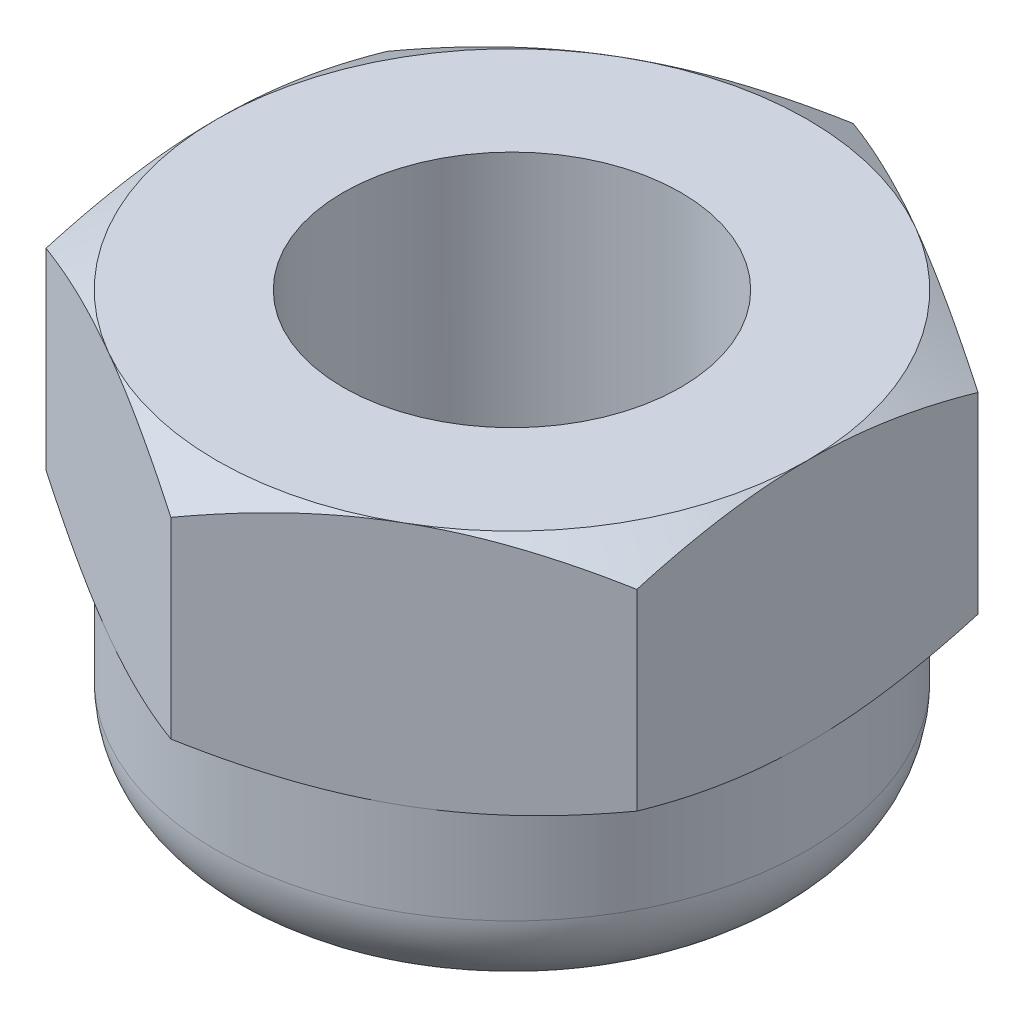
ISO-10303-21;
HEADER;
FILE_DESCRIPTION(('STEP AP214'),'2;1');
FILE_NAME('part.step','',(''),(''),'','','');
FILE_SCHEMA(('AUTOMOTIVE_DESIGN { 1 0 10303 214 1 1 1 1 }'));
ENDSEC;
DATA;
#1=APPLICATION_CONTEXT('core data for automotive mechanical design processes');
#2=APPLICATION_PROTOCOL_DEFINITION('international standard','automotive_design',2000,#1);
#3=PRODUCT_CONTEXT('',#1,'mechanical');
#4=PRODUCT('Part','Part','',(#3));
#5=PRODUCT_RELATED_PRODUCT_CATEGORY('part','',(#4));
#6=PRODUCT_DEFINITION_FORMATION('','',#4);
#7=PRODUCT_DEFINITION_CONTEXT('part definition',#1,'design');
#8=PRODUCT_DEFINITION('design','',#6,#7);
#9=PRODUCT_DEFINITION_SHAPE('','',#8);
#10=(LENGTH_UNIT() NAMED_UNIT(*) SI_UNIT(.MILLI.,.METRE.));
#11=(NAMED_UNIT(*) PLANE_ANGLE_UNIT() SI_UNIT($,.RADIAN.));
#12=(NAMED_UNIT(*) SI_UNIT($,.STERADIAN.) SOLID_ANGLE_UNIT());
#13=UNCERTAINTY_MEASURE_WITH_UNIT(LENGTH_MEASURE(1.E-05),#10,'distance_accuracy_value','');
#14=(GEOMETRIC_REPRESENTATION_CONTEXT(3) GLOBAL_UNCERTAINTY_ASSIGNED_CONTEXT((#13)) GLOBAL_UNIT_ASSIGNED_CONTEXT((#10,
#11,#12)) REPRESENTATION_CONTEXT('',''));
#15=CARTESIAN_POINT('',(0.,0.,0.));
#16=DIRECTION('',(0.,0.,1.));
#17=DIRECTION('',(1.,0.,0.));
#18=AXIS2_PLACEMENT_3D('',#15,#16,#17);
#19=CARTESIAN_POINT('',(3.5,2.9,2.02072594216369));
#20=DIRECTION('',(-1.,0.,0.));
#21=DIRECTION('',(0.,0.,1.));
#22=AXIS2_PLACEMENT_3D('',#19,#20,#21);
#23=PLANE('',#22);
#24=CARTESIAN_POINT('',(3.5,1.75221798405278,-5.51863367248825));
#25=CARTESIAN_POINT('',(3.5,1.67732442804157,-5.36498509851175));
#26=CARTESIAN_POINT('',(3.5,1.6031231891369,-5.21099341584793));
#27=CARTESIAN_POINT('',(3.5,1.45649296997795,-4.90214171197753));
#28=CARTESIAN_POINT('',(3.5,1.3840642522182,-4.74728156628347));
#29=CARTESIAN_POINT('',(3.5,1.24102143969356,-4.43575550019317));
#30=CARTESIAN_POINT('',(3.5,1.17041861680827,-4.27908438687699));
#31=CARTESIAN_POINT('',(3.5,1.03198343362489,-3.96452743537923));
#32=CARTESIAN_POINT('',(3.5,0.964150948265603,-3.80664165241465));
#33=CARTESIAN_POINT('',(3.5,0.829718098878579,-3.48396366444411));
#34=CARTESIAN_POINT('',(3.5,0.763239814940772,-3.31912032960149));
#35=CARTESIAN_POINT('',(3.5,0.635098415601103,-2.98753880843402));
#36=CARTESIAN_POINT('',(3.5,0.573435827779177,-2.82080041678345));
#37=CARTESIAN_POINT('',(3.5,0.456478517309419,-2.48544744392412));
#38=CARTESIAN_POINT('',(3.5,0.40117164651928,-2.31683714099685));
#39=CARTESIAN_POINT('',(3.5,0.298640302302864,-1.97719921369625));
#40=CARTESIAN_POINT('',(3.5,0.251413376907704,-1.80617233978074));
#41=CARTESIAN_POINT('',(3.5,0.167505297643178,-1.46257631451902));
#42=CARTESIAN_POINT('',(3.5,0.130763467984196,-1.29002225161434));
#43=CARTESIAN_POINT('',(3.5,0.0698337298556786,-0.942675952516883));
#44=CARTESIAN_POINT('',(3.5,0.0456444908928947,-0.767883955543815));
#45=CARTESIAN_POINT('',(3.5,0.0120616276352312,-0.419253617479358));
#46=CARTESIAN_POINT('',(3.5,0.0024708291488457,-0.245434751388826));
#47=CARTESIAN_POINT('',(3.5,-0.00162718328259984,0.102398182663509));
#48=CARTESIAN_POINT('',(3.5,0.00386568220883732,0.276412251648501));
#49=CARTESIAN_POINT('',(3.5,0.0254017587907872,0.569211961742458));
#50=CARTESIAN_POINT('',(3.5,0.0376207959948863,0.688298160754819));
#51=CARTESIAN_POINT('',(3.5,0.0684099076642928,0.925652102121974));
#52=CARTESIAN_POINT('',(3.5,0.0869807716158405,1.04391974087045));
#53=CARTESIAN_POINT('',(3.5,0.151250626382069,1.39730799314287));
#54=CARTESIAN_POINT('',(3.5,0.205496869475397,1.63089439911262));
#55=CARTESIAN_POINT('',(3.5,0.30023946922369,1.98029185795325));
#56=CARTESIAN_POINT('',(3.5,0.334507928406217,2.09789544468369));
#57=CARTESIAN_POINT('',(3.5,0.406774363526277,2.33196218309537));
#58=CARTESIAN_POINT('',(3.5,0.444772366161091,2.44842532660637));
#59=CARTESIAN_POINT('',(3.5,0.523874133729436,2.68024482179015));
#60=CARTESIAN_POINT('',(3.5,0.564977002789837,2.79560148198123));
#61=CARTESIAN_POINT('',(3.5,0.649788075888322,3.02534777801573));
#62=CARTESIAN_POINT('',(3.5,0.693496236198847,3.13973743005278));
#63=CARTESIAN_POINT('',(3.5,0.806380461684521,3.42691114161474));
#64=CARTESIAN_POINT('',(3.5,0.876982640338044,3.59913384480237));
#65=CARTESIAN_POINT('',(3.5,1.02204710120962,3.9419513449622));
#66=CARTESIAN_POINT('',(3.5,1.09650971093041,4.1125460023594));
#67=CARTESIAN_POINT('',(3.5,1.24845478974022,4.45243751951838));
#68=CARTESIAN_POINT('',(3.5,1.32593808601369,4.6217340083846));
#69=CARTESIAN_POINT('',(3.5,1.48327345238332,4.95922460715622));
#70=CARTESIAN_POINT('',(3.5,1.56312558567321,5.12741868750614));
#71=CARTESIAN_POINT('',(3.5,1.80570351704901,5.63109508774223));
#72=CARTESIAN_POINT('',(3.5,1.97124553878938,5.96521974920382));
#73=CARTESIAN_POINT('',(3.5,2.30721210046437,6.63091789328421));
#74=CARTESIAN_POINT('',(3.5,2.47763583410027,6.96249178586031));
#75=CARTESIAN_POINT('',(3.5,2.80566196800848,7.59268121527547));
#76=CARTESIAN_POINT('',(3.5,2.96295809914389,7.89145646849738));
#77=CARTESIAN_POINT('',(3.5,3.27962393001051,8.48792265891552));
#78=CARTESIAN_POINT('',(3.5,3.43899372934341,8.78561354314216));
#79=CARTESIAN_POINT('',(3.5,3.75881188742457,9.37926265804874));
#80=CARTESIAN_POINT('',(3.5,3.91925557679138,9.67522340748776));
#81=CARTESIAN_POINT('',(3.5,4.24135194779674,10.2664606109715));
#82=CARTESIAN_POINT('',(3.5,4.40300454687335,10.5617371099748));
#83=CARTESIAN_POINT('',(3.5,4.56510217991107,10.8567672978899));
#84=B_SPLINE_CURVE_WITH_KNOTS('',3,(#24,#25,#26,#27,#28,#29,#30,#31,#32,#33,#34,#35,#36,#37,#38,
#39,#40,#41,#42,#43,#44,#45,#46,#47,#48,#49,#50,#51,#52,#53,#54,#55,#56,#57,#58,#59,#60,#61,#62,
#63,#64,#65,#66,#67,#68,#69,#70,#71,#72,#73,#74,#75,#76,#77,#78,#79,#80,#81,#82,#83),
.UNSPECIFIED.,.F.,.F.,(4,2,2,2,2,2,2,2,2,2,2,2,2,2,2,2,2,2,2,2,2,2,2,2,2,2,2,2,2,4),(0.,
0.51279464820139,1.02566478271509,1.54117731607442,2.05666655189903,2.58983830237006,
3.12306838236736,3.65526168525764,4.18729319931276,4.7161804163529,5.24501156332019,
5.76663460089152,6.28826038553984,6.64722220323954,7.00622865352666,7.72459979118937,
8.09205003333389,8.45950290599815,8.82685015643985,9.19419124301126,9.75252231684298,
10.3109008348907,10.8694333483491,11.4279807752647,12.5465640652309,13.6649636552851,
14.6779080328988,15.6909012448293,16.7008557882807,17.7107419760252),.UNSPECIFIED.);
#85=CARTESIAN_POINT('',(3.5,0.312607391169548,-2.02072594216384));
#86=VERTEX_POINT('',#85);
#87=CARTESIAN_POINT('',(3.5,0.,0.));
#88=VERTEX_POINT('',#87);
#89=EDGE_CURVE('E152',#86,#88,#84,.T.);
#90=ORIENTED_EDGE('',*,*,#89,.F.);
#91=DIRECTION('',(0.,-1.,0.));
#92=VECTOR('',#91,1.);
#93=CARTESIAN_POINT('',(3.5,2.9,-2.02072594216369));
#94=LINE('',#93,#92);
#95=CARTESIAN_POINT('',(3.5,2.58739260883036,-2.02072594216369));
#96=VERTEX_POINT('',#95);
#97=EDGE_CURVE('E161',#96,#86,#94,.T.);
#98=ORIENTED_EDGE('',*,*,#97,.F.);
#99=CARTESIAN_POINT('',(3.5,1.14778201594725,-5.51863367248824));
#100=CARTESIAN_POINT('',(3.5,1.22267557195846,-5.36498509851174));
#101=CARTESIAN_POINT('',(3.5,1.29687681086313,-5.21099341584793));
#102=CARTESIAN_POINT('',(3.5,1.44350703002208,-4.90214171197753));
#103=CARTESIAN_POINT('',(3.5,1.51593574778183,-4.74728156628346));
#104=CARTESIAN_POINT('',(3.5,1.65897856030646,-4.43575550019317));
#105=CARTESIAN_POINT('',(3.5,1.72958138319175,-4.27908438687698));
#106=CARTESIAN_POINT('',(3.5,1.86801656637513,-3.96452743537922));
#107=CARTESIAN_POINT('',(3.5,1.93584905173442,-3.80664165241464));
#108=CARTESIAN_POINT('',(3.5,2.07028190112144,-3.4839636644441));
#109=CARTESIAN_POINT('',(3.5,2.13676018505924,-3.31912032960149));
#110=CARTESIAN_POINT('',(3.5,2.26490158439891,-2.98753880843402));
#111=CARTESIAN_POINT('',(3.5,2.32656417222084,-2.82080041678344));
#112=CARTESIAN_POINT('',(3.5,2.44352148269059,-2.48544744392411));
#113=CARTESIAN_POINT('',(3.5,2.49882835348073,-2.31683714099684));
#114=CARTESIAN_POINT('',(3.5,2.60135969769714,-1.97719921369624));
#115=CARTESIAN_POINT('',(3.5,2.6485866230923,-1.80617233978073));
#116=CARTESIAN_POINT('',(3.5,2.73249470235683,-1.46257631451902));
#117=CARTESIAN_POINT('',(3.5,2.76923653201581,-1.29002225161434));
#118=CARTESIAN_POINT('',(3.5,2.83016627014432,-0.942675952516881));
#119=CARTESIAN_POINT('',(3.5,2.85435550910711,-0.767883955543813));
#120=CARTESIAN_POINT('',(3.5,2.88793837236477,-0.419253617479357));
#121=CARTESIAN_POINT('',(3.5,2.89752917085115,-0.245434751388826));
#122=CARTESIAN_POINT('',(3.5,2.9016271832826,0.102398182663508));
#123=CARTESIAN_POINT('',(3.5,2.89613431779116,0.2764122516485));
#124=CARTESIAN_POINT('',(3.5,2.87459824120921,0.569211961742459));
#125=CARTESIAN_POINT('',(3.5,2.86237920400511,0.688298160754822));
#126=CARTESIAN_POINT('',(3.5,2.83159009233571,0.925652102121981));
#127=CARTESIAN_POINT('',(3.5,2.81301922838416,1.04391974087046));
#128=CARTESIAN_POINT('',(3.5,2.74874937361793,1.39730799314289));
#129=CARTESIAN_POINT('',(3.5,2.6945031305246,1.63089439911264));
#130=CARTESIAN_POINT('',(3.5,2.59976053077631,1.98029185795328));
#131=CARTESIAN_POINT('',(3.5,2.56549207159378,2.09789544468372));
#132=CARTESIAN_POINT('',(3.5,2.49322563647372,2.3319621830954));
#133=CARTESIAN_POINT('',(3.5,2.4552276338389,2.44842532660641));
#134=CARTESIAN_POINT('',(3.5,2.37612586627056,2.6802448217902));
#135=CARTESIAN_POINT('',(3.5,2.33502299721016,2.79560148198128));
#136=CARTESIAN_POINT('',(3.5,2.25021192411167,3.02534777801579));
#137=CARTESIAN_POINT('',(3.5,2.20650376380114,3.13973743005284));
#138=CARTESIAN_POINT('',(3.5,2.09361953831547,3.42691114161479));
#139=CARTESIAN_POINT('',(3.5,2.02301735966195,3.59913384480242));
#140=CARTESIAN_POINT('',(3.5,1.87795289879037,3.94195134496225));
#141=CARTESIAN_POINT('',(3.5,1.80349028906959,4.11254600235945));
#142=CARTESIAN_POINT('',(3.5,1.65154521025978,4.45243751951843));
#143=CARTESIAN_POINT('',(3.5,1.57406191398631,4.62173400838465));
#144=CARTESIAN_POINT('',(3.5,1.41672654761668,4.95922460715627));
#145=CARTESIAN_POINT('',(3.5,1.33687441432679,5.12741868750619));
#146=CARTESIAN_POINT('',(3.5,1.09429648295099,5.63109508774227));
#147=CARTESIAN_POINT('',(3.5,0.928754461210627,5.96521974920386));
#148=CARTESIAN_POINT('',(3.5,0.592787899535648,6.63091789328426));
#149=CARTESIAN_POINT('',(3.5,0.422364165899751,6.96249178586035));
#150=CARTESIAN_POINT('',(3.5,0.0943380319915446,7.59268121527551));
#151=CARTESIAN_POINT('',(3.5,-0.0629580991438635,7.89145646849742));
#152=CARTESIAN_POINT('',(3.5,-0.379623930010473,8.48792265891556));
#153=CARTESIAN_POINT('',(3.5,-0.538993729343374,8.7856135431422));
#154=CARTESIAN_POINT('',(3.5,-0.858811887424525,9.37926265804877));
#155=CARTESIAN_POINT('',(3.5,-1.01925557679133,9.67522340748779));
#156=CARTESIAN_POINT('',(3.5,-1.34135194779669,10.2664606109715));
#157=CARTESIAN_POINT('',(3.5,-1.50300454687329,10.5617371099749));
#158=CARTESIAN_POINT('',(3.5,-1.66510217991102,10.85676729789));
#159=B_SPLINE_CURVE_WITH_KNOTS('',3,(#99,#100,#101,#102,#103,#104,#105,#106,#107,#108,#109,#110,
#111,#112,#113,#114,#115,#116,#117,#118,#119,#120,#121,#122,#123,#124,#125,#126,#127,#128,#129,
#130,#131,#132,#133,#134,#135,#136,#137,#138,#139,#140,#141,#142,#143,#144,#145,#146,#147,#148,
#149,#150,#151,#152,#153,#154,#155,#156,#157,#158),.UNSPECIFIED.,.F.,.F.,(4,2,2,2,2,2,2,2,2,2,2,
2,2,2,2,2,2,2,2,2,2,2,2,2,2,2,2,2,2,4),(0.,0.51279464820139,1.02566478271509,1.54117731607441,
2.05666655189902,2.58983830237005,3.12306838236735,3.65526168525763,4.18729319931275,
4.71618041635289,5.24501156332018,5.7666346008915,6.28826038553982,6.64722220323953,
7.00622865352666,7.72459979118938,8.09205003333391,8.45950290599817,8.82685015643989,
9.19419124301131,9.75252231684302,10.3109008348907,10.8694333483491,11.4279807752647,
12.5465640652309,13.6649636552851,14.6779080328988,15.6909012448293,16.7008557882807,
17.7107419760252),.UNSPECIFIED.);
#160=CARTESIAN_POINT('',(3.5,2.9,0.));
#161=VERTEX_POINT('',#160);
#162=EDGE_CURVE('E226',#161,#96,#159,.F.);
#163=ORIENTED_EDGE('',*,*,#162,.F.);
#164=CARTESIAN_POINT('',(3.5,2.58739260883036,2.02072594216369));
#165=VERTEX_POINT('',#164);
#166=EDGE_CURVE('E233',#165,#161,#159,.F.);
#167=ORIENTED_EDGE('',*,*,#166,.F.);
#168=DIRECTION('',(0.,-1.,0.));
#169=VECTOR('',#168,1.);
#170=CARTESIAN_POINT('',(3.5,2.9,2.02072594216369));
#171=LINE('',#170,#169);
#172=CARTESIAN_POINT('',(3.5,0.312607391169645,2.02072594216369));
#173=VERTEX_POINT('',#172);
#174=EDGE_CURVE('E244',#165,#173,#171,.T.);
#175=ORIENTED_EDGE('',*,*,#174,.T.);
#176=EDGE_CURVE('E216',#88,#173,#84,.T.);
#177=ORIENTED_EDGE('',*,*,#176,.F.);
#178=EDGE_LOOP('',(#90,#98,#163,#167,#175,#177));
#179=FACE_BOUND('',#178,.T.);
#180=ADVANCED_FACE('F40',(#179),#23,.F.);
#181=CARTESIAN_POINT('',(3.5,2.9,-2.02072594216369));
#182=DIRECTION('',(-0.5,0.,0.866025403784439));
#183=DIRECTION('',(0.866025403784439,0.,0.5));
#184=AXIS2_PLACEMENT_3D('',#181,#182,#183);
#185=PLANE('',#184);
#186=CARTESIAN_POINT('',(-0.000199999999999978,0.312674060693372,-4.04156735438122));
#187=CARTESIAN_POINT('',(0.153607178452449,0.261385788989984,-3.9527667384984));
#188=CARTESIAN_POINT('',(0.308742010834424,0.214740953816197,-3.86319960126198));
#189=CARTESIAN_POINT('',(0.621698006576782,0.133321875533349,-3.68251437287562));
#190=CARTESIAN_POINT('',(0.779524730787496,0.0985764355845613,-3.59139307116725));
#191=CARTESIAN_POINT('',(1.09322221038013,0.0444900271828356,-3.41027974688034));
#192=CARTESIAN_POINT('',(1.24904469916069,0.0247890862603808,-3.32031559103708));
#193=CARTESIAN_POINT('',(1.56142288720538,0.00127013273725356,-3.13996396008051));
#194=CARTESIAN_POINT('',(1.71797745103423,-0.00256735545443535,-3.04957714051106));
#195=CARTESIAN_POINT('',(2.01050921992099,0.00541530187697738,-2.88068384499777));
#196=CARTESIAN_POINT('',(2.14653021245791,0.0152754340696069,-2.80215208834114));
#197=CARTESIAN_POINT('',(2.417686020289,0.0465264668994034,-2.64560020969753));
#198=CARTESIAN_POINT('',(2.55281989768468,0.0679280432857981,-2.5675806292065));
#199=CARTESIAN_POINT('',(2.82453479240518,0.121430407880577,-2.41070596159678));
#200=CARTESIAN_POINT('',(2.96108141927834,0.153757994445087,-2.33187072981463));
#201=CARTESIAN_POINT('',(3.2321380929445,0.227128933807995,-2.17537608630783));
#202=CARTESIAN_POINT('',(3.36665161246854,0.268155046569867,-2.09771466960098));
#203=CARTESIAN_POINT('',(3.5002,0.312674060693372,-2.02061047210985));
#204=B_SPLINE_CURVE_WITH_KNOTS('',3,(#186,#187,#188,#189,#190,#191,#192,#193,#194,#195,#196,
#197,#198,#199,#200,#201,#202,#203),.UNSPECIFIED.,.F.,.F.,(4,2,2,2,2,2,2,2,4),(0.,
0.554793832886254,1.11092123814984,1.65328467083219,2.19498204478403,2.6666513085086,
3.13875761298267,3.6213361260051,4.10296698719187),.UNSPECIFIED.);
#205=CARTESIAN_POINT('',(0.,0.312607391169644,-4.04145188432738));
#206=VERTEX_POINT('',#205);
#207=CARTESIAN_POINT('',(1.75,0.,-3.03108891324554));
#208=VERTEX_POINT('',#207);
#209=EDGE_CURVE('E139',#206,#208,#204,.T.);
#210=ORIENTED_EDGE('',*,*,#209,.F.);
#211=DIRECTION('',(0.,-1.,0.));
#212=VECTOR('',#211,1.);
#213=CARTESIAN_POINT('',(0.,2.9,-4.04145188432738));
#214=LINE('',#213,#212);
#215=CARTESIAN_POINT('',(0.,2.58739260883036,-4.04145188432738));
#216=VERTEX_POINT('',#215);
#217=EDGE_CURVE('E256',#216,#206,#214,.T.);
#218=ORIENTED_EDGE('',*,*,#217,.F.);
#219=CARTESIAN_POINT('',(3.5002,2.58732593930663,-2.02061047210985));
#220=CARTESIAN_POINT('',(3.34639282154755,2.63861421101002,-2.10941108799267));
#221=CARTESIAN_POINT('',(3.19125798916558,2.68525904618381,-2.19897822522909));
#222=CARTESIAN_POINT('',(2.87830199342322,2.76667812446665,-2.37966345361545));
#223=CARTESIAN_POINT('',(2.72047526921251,2.80142356441544,-2.47078475532382));
#224=CARTESIAN_POINT('',(2.40677778961987,2.85550997281717,-2.65189807961073));
#225=CARTESIAN_POINT('',(2.25095530083931,2.87521091373962,-2.74186223545399));
#226=CARTESIAN_POINT('',(1.93857711279463,2.89872986726275,-2.92221386641055));
#227=CARTESIAN_POINT('',(1.78202254896577,2.90256735545444,-3.01260068598001));
#228=CARTESIAN_POINT('',(1.48949078007901,2.89458469812302,-3.1814939814933));
#229=CARTESIAN_POINT('',(1.3534697875421,2.88472456593039,-3.26002573814993));
#230=CARTESIAN_POINT('',(1.08231397971101,2.8534735331006,-3.41657761679354));
#231=CARTESIAN_POINT('',(0.947180102315318,2.8320719567142,-3.49459719728457));
#232=CARTESIAN_POINT('',(0.675465207594817,2.77856959211943,-3.65147186489429));
#233=CARTESIAN_POINT('',(0.538918580721665,2.74624200555492,-3.73030709667644));
#234=CARTESIAN_POINT('',(0.267861907055498,2.67287106619201,-3.88680174018324));
#235=CARTESIAN_POINT('',(0.133348387531463,2.63184495343014,-3.96446315689009));
#236=CARTESIAN_POINT('',(-0.000200000000000802,2.58732593930663,-4.04156735438122));
#237=B_SPLINE_CURVE_WITH_KNOTS('',3,(#219,#220,#221,#222,#223,#224,#225,#226,#227,#228,#229,
#230,#231,#232,#233,#234,#235,#236),.UNSPECIFIED.,.F.,.F.,(4,2,2,2,2,2,2,2,4),(0.,
0.554793832886253,1.11092123814983,1.65328467083218,2.19498204478403,2.6666513085086,
3.13875761298267,3.62133612600509,4.10296698719187),.UNSPECIFIED.);
#238=CARTESIAN_POINT('',(1.75,2.9,-3.03108891324554));
#239=VERTEX_POINT('',#238);
#240=EDGE_CURVE('E235',#239,#216,#237,.T.);
#241=ORIENTED_EDGE('',*,*,#240,.F.);
#242=EDGE_CURVE('E234',#96,#239,#237,.T.);
#243=ORIENTED_EDGE('',*,*,#242,.F.);
#244=ORIENTED_EDGE('',*,*,#97,.T.);
#245=EDGE_CURVE('E147',#208,#86,#204,.T.);
#246=ORIENTED_EDGE('',*,*,#245,.F.);
#247=EDGE_LOOP('',(#210,#218,#241,#243,#244,#246));
#248=FACE_BOUND('',#247,.T.);
#249=ADVANCED_FACE('F158',(#248),#185,.F.);
#250=CARTESIAN_POINT('',(0.,2.9,-4.04145188432738));
#251=DIRECTION('',(0.5,0.,0.866025403784439));
#252=DIRECTION('',(0.866025403784439,0.,-0.5));
#253=AXIS2_PLACEMENT_3D('',#250,#251,#252);
#254=PLANE('',#253);
#255=CARTESIAN_POINT('',(-3.5002,0.312674060693372,-2.02061047210985));
#256=CARTESIAN_POINT('',(-3.34639282154755,0.261385788989985,-2.10941108799267));
#257=CARTESIAN_POINT('',(-3.19125798916558,0.214740953816198,-2.19897822522909));
#258=CARTESIAN_POINT('',(-2.87830199342322,0.133321875533349,-2.37966345361545));
#259=CARTESIAN_POINT('',(-2.7204752692125,0.0985764355845615,-2.47078475532382));
#260=CARTESIAN_POINT('',(-2.40677778961987,0.0444900271828358,-2.65189807961074));
#261=CARTESIAN_POINT('',(-2.25095530083931,0.0247890862603812,-2.74186223545399));
#262=CARTESIAN_POINT('',(-1.93857711279463,0.00127013273725388,-2.92221386641056));
#263=CARTESIAN_POINT('',(-1.78202254896577,-0.00256735545443532,-3.01260068598001));
#264=CARTESIAN_POINT('',(-1.48949078007901,0.00541530187697735,-3.1814939814933));
#265=CARTESIAN_POINT('',(-1.35346978754209,0.015275434069607,-3.26002573814993));
#266=CARTESIAN_POINT('',(-1.082313979711,0.0465264668994036,-3.41657761679354));
#267=CARTESIAN_POINT('',(-0.947180102315317,0.0679280432857982,-3.49459719728458));
#268=CARTESIAN_POINT('',(-0.675465207594816,0.121430407880577,-3.65147186489429));
#269=CARTESIAN_POINT('',(-0.538918580721664,0.153757994445087,-3.73030709667644));
#270=CARTESIAN_POINT('',(-0.267861907055498,0.227128933807995,-3.88680174018324));
#271=CARTESIAN_POINT('',(-0.133348387531463,0.268155046569868,-3.96446315689009));
#272=CARTESIAN_POINT('',(0.00020000000000004,0.312674060693372,-4.04156735438122));
#273=B_SPLINE_CURVE_WITH_KNOTS('',3,(#255,#256,#257,#258,#259,#260,#261,#262,#263,#264,#265,
#266,#267,#268,#269,#270,#271,#272),.UNSPECIFIED.,.F.,.F.,(4,2,2,2,2,2,2,2,4),(0.,
0.554793832886254,1.11092123814984,1.65328467083219,2.19498204478403,2.6666513085086,
3.13875761298267,3.6213361260051,4.10296698719187),.UNSPECIFIED.);
#274=CARTESIAN_POINT('',(-3.5,0.312607391169548,-2.02072594216384));
#275=VERTEX_POINT('',#274);
#276=CARTESIAN_POINT('',(-1.75,0.,-3.03108891324554));
#277=VERTEX_POINT('',#276);
#278=EDGE_CURVE('E313',#275,#277,#273,.T.);
#279=ORIENTED_EDGE('',*,*,#278,.F.);
#280=DIRECTION('',(0.,-1.,0.));
#281=VECTOR('',#280,1.);
#282=CARTESIAN_POINT('',(-3.5,2.9,-2.02072594216369));
#283=LINE('',#282,#281);
#284=CARTESIAN_POINT('',(-3.5,2.58739260883046,-2.02072594216384));
#285=VERTEX_POINT('',#284);
#286=EDGE_CURVE('E253',#285,#275,#283,.T.);
#287=ORIENTED_EDGE('',*,*,#286,.F.);
#288=CARTESIAN_POINT('',(0.00020000000000009,2.58732593930663,-4.04156735438122));
#289=CARTESIAN_POINT('',(-0.15360717845245,2.63861421101002,-3.9527667384984));
#290=CARTESIAN_POINT('',(-0.308742010834424,2.68525904618381,-3.86319960126198));
#291=CARTESIAN_POINT('',(-0.621698006576781,2.76667812446665,-3.68251437287562));
#292=CARTESIAN_POINT('',(-0.779524730787495,2.80142356441544,-3.59139307116725));
#293=CARTESIAN_POINT('',(-1.09322221038013,2.85550997281717,-3.41027974688034));
#294=CARTESIAN_POINT('',(-1.24904469916069,2.87521091373962,-3.32031559103708));
#295=CARTESIAN_POINT('',(-1.56142288720537,2.89872986726275,-3.13996396008052));
#296=CARTESIAN_POINT('',(-1.71797745103423,2.90256735545444,-3.04957714051106));
#297=CARTESIAN_POINT('',(-2.01050921992099,2.89458469812302,-2.88068384499777));
#298=CARTESIAN_POINT('',(-2.1465302124579,2.88472456593039,-2.80215208834115));
#299=CARTESIAN_POINT('',(-2.41768602028899,2.8534735331006,-2.64560020969754));
#300=CARTESIAN_POINT('',(-2.55281989768468,2.8320719567142,-2.5675806292065));
#301=CARTESIAN_POINT('',(-2.82453479240518,2.77856959211943,-2.41070596159679));
#302=CARTESIAN_POINT('',(-2.96108141927834,2.74624200555492,-2.33187072981464));
#303=CARTESIAN_POINT('',(-3.2321380929445,2.67287106619201,-2.17537608630783));
#304=CARTESIAN_POINT('',(-3.36665161246854,2.63184495343014,-2.09771466960098));
#305=CARTESIAN_POINT('',(-3.5002,2.58732593930663,-2.02061047210985));
#306=B_SPLINE_CURVE_WITH_KNOTS('',3,(#288,#289,#290,#291,#292,#293,#294,#295,#296,#297,#298,
#299,#300,#301,#302,#303,#304,#305),.UNSPECIFIED.,.F.,.F.,(4,2,2,2,2,2,2,2,4),(0.,
0.554793832886253,1.11092123814983,1.65328467083218,2.19498204478403,2.6666513085086,
3.13875761298267,3.62133612600509,4.10296698719187),.UNSPECIFIED.);
#307=CARTESIAN_POINT('',(-1.75,2.9,-3.03108891324554));
#308=VERTEX_POINT('',#307);
#309=EDGE_CURVE('E295',#308,#285,#306,.T.);
#310=ORIENTED_EDGE('',*,*,#309,.F.);
#311=EDGE_CURVE('E300',#216,#308,#306,.T.);
#312=ORIENTED_EDGE('',*,*,#311,.F.);
#313=ORIENTED_EDGE('',*,*,#217,.T.);
#314=EDGE_CURVE('E141',#277,#206,#273,.T.);
#315=ORIENTED_EDGE('',*,*,#314,.F.);
#316=EDGE_LOOP('',(#279,#287,#310,#312,#313,#315));
#317=FACE_BOUND('',#316,.T.);
#318=ADVANCED_FACE('F301',(#317),#254,.F.);
#319=CARTESIAN_POINT('',(-3.5,2.9,-2.02072594216369));
#320=DIRECTION('',(1.,0.,0.));
#321=DIRECTION('',(0.,0.,-1.));
#322=AXIS2_PLACEMENT_3D('',#319,#320,#321);
#323=PLANE('',#322);
#324=CARTESIAN_POINT('',(-3.5,1.75221798405278,-5.51863367248825));
#325=CARTESIAN_POINT('',(-3.5,1.67732442804157,-5.36498509851175));
#326=CARTESIAN_POINT('',(-3.5,1.6031231891369,-5.21099341584793));
#327=CARTESIAN_POINT('',(-3.5,1.45649296997795,-4.90214171197753));
#328=CARTESIAN_POINT('',(-3.5,1.3840642522182,-4.74728156628347));
#329=CARTESIAN_POINT('',(-3.5,1.24102143969356,-4.43575550019318));
#330=CARTESIAN_POINT('',(-3.5,1.17041861680828,-4.27908438687699));
#331=CARTESIAN_POINT('',(-3.5,1.03198343362489,-3.96452743537923));
#332=CARTESIAN_POINT('',(-3.5,0.964150948265605,-3.80664165241465));
#333=CARTESIAN_POINT('',(-3.5,0.829718098878581,-3.48396366444411));
#334=CARTESIAN_POINT('',(-3.5,0.763239814940773,-3.3191203296015));
#335=CARTESIAN_POINT('',(-3.5,0.635098415601103,-2.98753880843403));
#336=CARTESIAN_POINT('',(-3.5,0.573435827779178,-2.82080041678345));
#337=CARTESIAN_POINT('',(-3.5,0.45647851730942,-2.48544744392412));
#338=CARTESIAN_POINT('',(-3.5,0.401171646519281,-2.31683714099685));
#339=CARTESIAN_POINT('',(-3.5,0.298640302302864,-1.97719921369625));
#340=CARTESIAN_POINT('',(-3.5,0.251413376907704,-1.80617233978074));
#341=CARTESIAN_POINT('',(-3.5,0.167505297643178,-1.46257631451902));
#342=CARTESIAN_POINT('',(-3.5,0.130763467984196,-1.29002225161435));
#343=CARTESIAN_POINT('',(-3.5,0.0698337298556787,-0.942675952516884));
#344=CARTESIAN_POINT('',(-3.5,0.0456444908928949,-0.767883955543815));
#345=CARTESIAN_POINT('',(-3.5,0.0120616276352313,-0.419253617479359));
#346=CARTESIAN_POINT('',(-3.5,0.00247082914884571,-0.245434751388827));
#347=CARTESIAN_POINT('',(-3.5,-0.00162718328260011,0.102398182663507));
#348=CARTESIAN_POINT('',(-3.5,0.00386568220883692,0.2764122516485));
#349=CARTESIAN_POINT('',(-3.5,0.0254017587907868,0.569211961742456));
#350=CARTESIAN_POINT('',(-3.5,0.0376207959948859,0.688298160754818));
#351=CARTESIAN_POINT('',(-3.5,0.0684099076642923,0.925652102121972));
#352=CARTESIAN_POINT('',(-3.5,0.0869807716158401,1.04391974087045));
#353=CARTESIAN_POINT('',(-3.5,0.151250626382069,1.39730799314287));
#354=CARTESIAN_POINT('',(-3.5,0.205496869475396,1.63089439911262));
#355=CARTESIAN_POINT('',(-3.5,0.300239469223689,1.98029185795324));
#356=CARTESIAN_POINT('',(-3.5,0.334507928406216,2.09789544468369));
#357=CARTESIAN_POINT('',(-3.5,0.406774363526276,2.33196218309536));
#358=CARTESIAN_POINT('',(-3.5,0.444772366161089,2.44842532660637));
#359=CARTESIAN_POINT('',(-3.5,0.523874133729434,2.68024482179015));
#360=CARTESIAN_POINT('',(-3.5,0.564977002789836,2.79560148198123));
#361=CARTESIAN_POINT('',(-3.5,0.64978807588832,3.02534777801573));
#362=CARTESIAN_POINT('',(-3.5,0.693496236198845,3.13973743005278));
#363=CARTESIAN_POINT('',(-3.5,0.80638046168452,3.42691114161473));
#364=CARTESIAN_POINT('',(-3.5,0.876982640338043,3.59913384480236));
#365=CARTESIAN_POINT('',(-3.5,1.02204710120962,3.9419513449622));
#366=CARTESIAN_POINT('',(-3.5,1.09650971093041,4.1125460023594));
#367=CARTESIAN_POINT('',(-3.5,1.24845478974022,4.45243751951838));
#368=CARTESIAN_POINT('',(-3.5,1.32593808601369,4.6217340083846));
#369=CARTESIAN_POINT('',(-3.5,1.48327345238332,4.95922460715622));
#370=CARTESIAN_POINT('',(-3.5,1.56312558567321,5.12741868750614));
#371=CARTESIAN_POINT('',(-3.5,1.80570351704901,5.63109508774222));
#372=CARTESIAN_POINT('',(-3.5,1.97124553878938,5.96521974920382));
#373=CARTESIAN_POINT('',(-3.5,2.30721210046437,6.63091789328421));
#374=CARTESIAN_POINT('',(-3.5,2.47763583410027,6.96249178586031));
#375=CARTESIAN_POINT('',(-3.5,2.80566196800848,7.59268121527547));
#376=CARTESIAN_POINT('',(-3.5,2.96295809914389,7.89145646849738));
#377=CARTESIAN_POINT('',(-3.5,3.27962393001051,8.48792265891552));
#378=CARTESIAN_POINT('',(-3.5,3.43899372934341,8.78561354314216));
#379=CARTESIAN_POINT('',(-3.5,3.75881188742457,9.37926265804873));
#380=CARTESIAN_POINT('',(-3.5,3.91925557679138,9.67522340748775));
#381=CARTESIAN_POINT('',(-3.5,4.24135194779674,10.2664606109714));
#382=CARTESIAN_POINT('',(-3.5,4.40300454687334,10.5617371099748));
#383=CARTESIAN_POINT('',(-3.5,4.56510217991107,10.8567672978899));
#384=B_SPLINE_CURVE_WITH_KNOTS('',3,(#324,#325,#326,#327,#328,#329,#330,#331,#332,#333,#334,
#335,#336,#337,#338,#339,#340,#341,#342,#343,#344,#345,#346,#347,#348,#349,#350,#351,#352,#353,
#354,#355,#356,#357,#358,#359,#360,#361,#362,#363,#364,#365,#366,#367,#368,#369,#370,#371,#372,
#373,#374,#375,#376,#377,#378,#379,#380,#381,#382,#383),.UNSPECIFIED.,.F.,.F.,(4,2,2,2,2,2,2,2,
2,2,2,2,2,2,2,2,2,2,2,2,2,2,2,2,2,2,2,2,2,4),(0.,0.51279464820139,1.02566478271509,
1.54117731607442,2.05666655189902,2.58983830237006,3.12306838236735,3.65526168525764,
4.18729319931276,4.7161804163529,5.2450115633202,5.76663460089152,6.28826038553984,
6.64722220323954,7.00622865352666,7.72459979118937,8.09205003333389,8.45950290599814,
8.82685015643985,9.19419124301126,9.75252231684298,10.3109008348907,10.8694333483491,
11.4279807752647,12.5465640652309,13.6649636552851,14.6779080328988,15.6909012448293,
16.7008557882807,17.7107419760252),.UNSPECIFIED.);
#385=CARTESIAN_POINT('',(-3.5,0.312607391169644,2.02072594216369));
#386=VERTEX_POINT('',#385);
#387=CARTESIAN_POINT('',(-3.5,0.,0.));
#388=VERTEX_POINT('',#387);
#389=EDGE_CURVE('E162',#386,#388,#384,.F.);
#390=ORIENTED_EDGE('',*,*,#389,.F.);
#391=DIRECTION('',(0.,-1.,0.));
#392=VECTOR('',#391,1.);
#393=CARTESIAN_POINT('',(-3.5,2.9,2.02072594216369));
#394=LINE('',#393,#392);
#395=CARTESIAN_POINT('',(-3.5,2.58739260883036,2.02072594216369));
#396=VERTEX_POINT('',#395);
#397=EDGE_CURVE('E250',#396,#386,#394,.T.);
#398=ORIENTED_EDGE('',*,*,#397,.F.);
#399=CARTESIAN_POINT('',(-3.5,1.14778201594725,-5.51863367248824));
#400=CARTESIAN_POINT('',(-3.5,1.22267557195846,-5.36498509851175));
#401=CARTESIAN_POINT('',(-3.5,1.29687681086313,-5.21099341584793));
#402=CARTESIAN_POINT('',(-3.5,1.44350703002208,-4.90214171197753));
#403=CARTESIAN_POINT('',(-3.5,1.51593574778182,-4.74728156628346));
#404=CARTESIAN_POINT('',(-3.5,1.65897856030646,-4.43575550019317));
#405=CARTESIAN_POINT('',(-3.5,1.72958138319175,-4.27908438687698));
#406=CARTESIAN_POINT('',(-3.5,1.86801656637513,-3.96452743537922));
#407=CARTESIAN_POINT('',(-3.5,1.93584905173441,-3.80664165241464));
#408=CARTESIAN_POINT('',(-3.5,2.07028190112144,-3.48396366444411));
#409=CARTESIAN_POINT('',(-3.5,2.13676018505924,-3.31912032960149));
#410=CARTESIAN_POINT('',(-3.5,2.26490158439891,-2.98753880843402));
#411=CARTESIAN_POINT('',(-3.5,2.32656417222083,-2.82080041678345));
#412=CARTESIAN_POINT('',(-3.5,2.44352148269059,-2.48544744392412));
#413=CARTESIAN_POINT('',(-3.5,2.49882835348073,-2.31683714099685));
#414=CARTESIAN_POINT('',(-3.5,2.60135969769714,-1.97719921369625));
#415=CARTESIAN_POINT('',(-3.5,2.6485866230923,-1.80617233978074));
#416=CARTESIAN_POINT('',(-3.5,2.73249470235683,-1.46257631451902));
#417=CARTESIAN_POINT('',(-3.5,2.76923653201581,-1.29002225161434));
#418=CARTESIAN_POINT('',(-3.5,2.83016627014432,-0.942675952516883));
#419=CARTESIAN_POINT('',(-3.5,2.85435550910711,-0.767883955543815));
#420=CARTESIAN_POINT('',(-3.5,2.88793837236477,-0.419253617479359));
#421=CARTESIAN_POINT('',(-3.5,2.89752917085115,-0.245434751388827));
#422=CARTESIAN_POINT('',(-3.5,2.9016271832826,0.102398182663506));
#423=CARTESIAN_POINT('',(-3.5,2.89613431779116,0.276412251648499));
#424=CARTESIAN_POINT('',(-3.5,2.87459824120921,0.569211961742457));
#425=CARTESIAN_POINT('',(-3.5,2.86237920400511,0.688298160754821));
#426=CARTESIAN_POINT('',(-3.5,2.83159009233571,0.92565210212198));
#427=CARTESIAN_POINT('',(-3.5,2.81301922838416,1.04391974087046));
#428=CARTESIAN_POINT('',(-3.5,2.74874937361793,1.39730799314289));
#429=CARTESIAN_POINT('',(-3.5,2.6945031305246,1.63089439911264));
#430=CARTESIAN_POINT('',(-3.5,2.59976053077631,1.98029185795328));
#431=CARTESIAN_POINT('',(-3.5,2.56549207159378,2.09789544468372));
#432=CARTESIAN_POINT('',(-3.5,2.49322563647372,2.3319621830954));
#433=CARTESIAN_POINT('',(-3.5,2.45522763383891,2.44842532660641));
#434=CARTESIAN_POINT('',(-3.5,2.37612586627056,2.6802448217902));
#435=CARTESIAN_POINT('',(-3.5,2.33502299721016,2.79560148198127));
#436=CARTESIAN_POINT('',(-3.5,2.25021192411167,3.02534777801579));
#437=CARTESIAN_POINT('',(-3.5,2.20650376380115,3.13973743005284));
#438=CARTESIAN_POINT('',(-3.5,2.09361953831547,3.42691114161479));
#439=CARTESIAN_POINT('',(-3.5,2.02301735966195,3.59913384480242));
#440=CARTESIAN_POINT('',(-3.5,1.87795289879037,3.94195134496225));
#441=CARTESIAN_POINT('',(-3.5,1.80349028906959,4.11254600235945));
#442=CARTESIAN_POINT('',(-3.5,1.65154521025978,4.45243751951843));
#443=CARTESIAN_POINT('',(-3.5,1.57406191398631,4.62173400838465));
#444=CARTESIAN_POINT('',(-3.5,1.41672654761668,4.95922460715627));
#445=CARTESIAN_POINT('',(-3.5,1.3368744143268,5.12741868750618));
#446=CARTESIAN_POINT('',(-3.5,1.094296482951,5.63109508774227));
#447=CARTESIAN_POINT('',(-3.5,0.928754461210629,5.96521974920386));
#448=CARTESIAN_POINT('',(-3.5,0.59278789953565,6.63091789328425));
#449=CARTESIAN_POINT('',(-3.5,0.422364165899752,6.96249178586035));
#450=CARTESIAN_POINT('',(-3.5,0.0943380319915456,7.59268121527551));
#451=CARTESIAN_POINT('',(-3.5,-0.0629580991438627,7.89145646849742));
#452=CARTESIAN_POINT('',(-3.5,-0.379623930010473,8.48792265891556));
#453=CARTESIAN_POINT('',(-3.5,-0.538993729343373,8.7856135431422));
#454=CARTESIAN_POINT('',(-3.5,-0.858811887424524,9.37926265804877));
#455=CARTESIAN_POINT('',(-3.5,-1.01925557679133,9.67522340748779));
#456=CARTESIAN_POINT('',(-3.5,-1.34135194779669,10.2664606109715));
#457=CARTESIAN_POINT('',(-3.5,-1.50300454687329,10.5617371099749));
#458=CARTESIAN_POINT('',(-3.5,-1.66510217991102,10.85676729789));
#459=B_SPLINE_CURVE_WITH_KNOTS('',3,(#399,#400,#401,#402,#403,#404,#405,#406,#407,#408,#409,
#410,#411,#412,#413,#414,#415,#416,#417,#418,#419,#420,#421,#422,#423,#424,#425,#426,#427,#428,
#429,#430,#431,#432,#433,#434,#435,#436,#437,#438,#439,#440,#441,#442,#443,#444,#445,#446,#447,
#448,#449,#450,#451,#452,#453,#454,#455,#456,#457,#458),.UNSPECIFIED.,.F.,.F.,(4,2,2,2,2,2,2,2,
2,2,2,2,2,2,2,2,2,2,2,2,2,2,2,2,2,2,2,2,2,4),(0.,0.512794648201389,1.02566478271509,
1.54117731607441,2.05666655189902,2.58983830237005,3.12306838236735,3.65526168525763,
4.18729319931275,4.71618041635289,5.24501156332018,5.7666346008915,6.28826038553983,
6.64722220323953,7.00622865352666,7.72459979118938,8.09205003333391,8.45950290599817,
8.82685015643989,9.19419124301131,9.75252231684302,10.3109008348907,10.8694333483491,
11.4279807752647,12.5465640652309,13.6649636552851,14.6779080328988,15.6909012448293,
16.7008557882807,17.7107419760252),.UNSPECIFIED.);
#460=CARTESIAN_POINT('',(-3.5,2.9,0.));
#461=VERTEX_POINT('',#460);
#462=EDGE_CURVE('E289',#461,#396,#459,.T.);
#463=ORIENTED_EDGE('',*,*,#462,.F.);
#464=EDGE_CURVE('E294',#285,#461,#459,.T.);
#465=ORIENTED_EDGE('',*,*,#464,.F.);
#466=ORIENTED_EDGE('',*,*,#286,.T.);
#467=EDGE_CURVE('E146',#388,#275,#384,.F.);
#468=ORIENTED_EDGE('',*,*,#467,.F.);
#469=EDGE_LOOP('',(#390,#398,#463,#465,#466,#468));
#470=FACE_BOUND('',#469,.T.);
#471=ADVANCED_FACE('F276',(#470),#323,.F.);
#472=CARTESIAN_POINT('',(-3.5,2.9,2.02072594216369));
#473=DIRECTION('',(0.5,0.,-0.866025403784439));
#474=DIRECTION('',(-0.866025403784439,0.,-0.5));
#475=AXIS2_PLACEMENT_3D('',#472,#473,#474);
#476=PLANE('',#475);
#477=CARTESIAN_POINT('',(0.000200000000000197,0.312674060693372,4.04156735438122));
#478=CARTESIAN_POINT('',(-0.153607178452449,0.261385788989985,3.9527667384984));
#479=CARTESIAN_POINT('',(-0.308742010834424,0.214740953816198,3.86319960126198));
#480=CARTESIAN_POINT('',(-0.621698006576782,0.133321875533349,3.68251437287562));
#481=CARTESIAN_POINT('',(-0.779524730787496,0.0985764355845614,3.59139307116725));
#482=CARTESIAN_POINT('',(-1.09322221038013,0.0444900271828357,3.41027974688034));
#483=CARTESIAN_POINT('',(-1.24904469916069,0.0247890862603812,3.32031559103708));
#484=CARTESIAN_POINT('',(-1.56142288720538,0.00127013273725391,3.13996396008051));
#485=CARTESIAN_POINT('',(-1.71797745103423,-0.00256735545443532,3.04957714051106));
#486=CARTESIAN_POINT('',(-2.01050921992099,0.00541530187697713,2.88068384499777));
#487=CARTESIAN_POINT('',(-2.14653021245791,0.0152754340696066,2.80215208834114));
#488=CARTESIAN_POINT('',(-2.417686020289,0.0465264668994033,2.64560020969753));
#489=CARTESIAN_POINT('',(-2.55281989768468,0.067928043285798,2.5675806292065));
#490=CARTESIAN_POINT('',(-2.82453479240519,0.121430407880577,2.41070596159678));
#491=CARTESIAN_POINT('',(-2.96108141927834,0.153757994445087,2.33187072981463));
#492=CARTESIAN_POINT('',(-3.2321380929445,0.227128933807995,2.17537608630783));
#493=CARTESIAN_POINT('',(-3.36665161246854,0.268155046569868,2.09771466960098));
#494=CARTESIAN_POINT('',(-3.5002,0.312674060693372,2.02061047210985));
#495=B_SPLINE_CURVE_WITH_KNOTS('',3,(#477,#478,#479,#480,#481,#482,#483,#484,#485,#486,#487,
#488,#489,#490,#491,#492,#493,#494),.UNSPECIFIED.,.F.,.F.,(4,2,2,2,2,2,2,2,4),(0.,
0.554793832886254,1.11092123814984,1.65328467083219,2.19498204478403,2.6666513085086,
3.13875761298267,3.6213361260051,4.10296698719187),.UNSPECIFIED.);
#496=CARTESIAN_POINT('',(0.,0.312607391169645,4.04145188432738));
#497=VERTEX_POINT('',#496);
#498=CARTESIAN_POINT('',(-1.75,0.,3.03108891324554));
#499=VERTEX_POINT('',#498);
#500=EDGE_CURVE('E209',#497,#499,#495,.T.);
#501=ORIENTED_EDGE('',*,*,#500,.F.);
#502=DIRECTION('',(0.,-1.,0.));
#503=VECTOR('',#502,1.);
#504=CARTESIAN_POINT('',(0.,2.9,4.04145188432738));
#505=LINE('',#504,#503);
#506=CARTESIAN_POINT('',(0.,2.58739260883036,4.04145188432738));
#507=VERTEX_POINT('',#506);
#508=EDGE_CURVE('E247',#507,#497,#505,.T.);
#509=ORIENTED_EDGE('',*,*,#508,.F.);
#510=CARTESIAN_POINT('',(-3.5002,2.58732593930663,2.02061047210985));
#511=CARTESIAN_POINT('',(-3.34639282154755,2.63861421101002,2.10941108799267));
#512=CARTESIAN_POINT('',(-3.19125798916558,2.68525904618381,2.19897822522909));
#513=CARTESIAN_POINT('',(-2.87830199342322,2.76667812446665,2.37966345361545));
#514=CARTESIAN_POINT('',(-2.72047526921251,2.80142356441544,2.47078475532382));
#515=CARTESIAN_POINT('',(-2.40677778961988,2.85550997281717,2.65189807961073));
#516=CARTESIAN_POINT('',(-2.25095530083931,2.87521091373962,2.74186223545399));
#517=CARTESIAN_POINT('',(-1.93857711279463,2.89872986726275,2.92221386641055));
#518=CARTESIAN_POINT('',(-1.78202254896577,2.90256735545444,3.01260068598001));
#519=CARTESIAN_POINT('',(-1.48949078007901,2.89458469812302,3.1814939814933));
#520=CARTESIAN_POINT('',(-1.3534697875421,2.88472456593039,3.26002573814993));
#521=CARTESIAN_POINT('',(-1.08231397971101,2.8534735331006,3.41657761679354));
#522=CARTESIAN_POINT('',(-0.947180102315319,2.8320719567142,3.49459719728458));
#523=CARTESIAN_POINT('',(-0.675465207594817,2.77856959211943,3.65147186489429));
#524=CARTESIAN_POINT('',(-0.538918580721665,2.74624200555492,3.73030709667644));
#525=CARTESIAN_POINT('',(-0.267861907055498,2.67287106619201,3.88680174018324));
#526=CARTESIAN_POINT('',(-0.133348387531463,2.63184495343014,3.96446315689009));
#527=CARTESIAN_POINT('',(0.000200000000000463,2.58732593930663,4.04156735438122));
#528=B_SPLINE_CURVE_WITH_KNOTS('',3,(#510,#511,#512,#513,#514,#515,#516,#517,#518,#519,#520,
#521,#522,#523,#524,#525,#526,#527),.UNSPECIFIED.,.F.,.F.,(4,2,2,2,2,2,2,2,4),(0.,
0.554793832886252,1.11092123814983,1.65328467083218,2.19498204478403,2.6666513085086,
3.13875761298267,3.6213361260051,4.10296698719187),.UNSPECIFIED.);
#529=CARTESIAN_POINT('',(-1.75,2.9,3.03108891324554));
#530=VERTEX_POINT('',#529);
#531=EDGE_CURVE('E281',#530,#507,#528,.T.);
#532=ORIENTED_EDGE('',*,*,#531,.F.);
#533=EDGE_CURVE('E287',#396,#530,#528,.T.);
#534=ORIENTED_EDGE('',*,*,#533,.F.);
#535=ORIENTED_EDGE('',*,*,#397,.T.);
#536=EDGE_CURVE('E164',#499,#386,#495,.T.);
#537=ORIENTED_EDGE('',*,*,#536,.F.);
#538=EDGE_LOOP('',(#501,#509,#532,#534,#535,#537));
#539=FACE_BOUND('',#538,.T.);
#540=ADVANCED_FACE('F271',(#539),#476,.F.);
#541=CARTESIAN_POINT('',(0.,2.9,4.04145188432738));
#542=DIRECTION('',(-0.5,0.,-0.866025403784439));
#543=DIRECTION('',(-0.866025403784439,0.,0.5));
#544=AXIS2_PLACEMENT_3D('',#541,#542,#543);
#545=PLANE('',#544);
#546=CARTESIAN_POINT('',(3.5002,0.312674060693373,2.02061047210985));
#547=CARTESIAN_POINT('',(3.34639282154755,0.261385788989985,2.10941108799267));
#548=CARTESIAN_POINT('',(3.19125798916558,0.214740953816198,2.19897822522909));
#549=CARTESIAN_POINT('',(2.87830199342322,0.133321875533349,2.37966345361545));
#550=CARTESIAN_POINT('',(2.7204752692125,0.0985764355845618,2.47078475532382));
#551=CARTESIAN_POINT('',(2.40677778961987,0.044490027182836,2.65189807961074));
#552=CARTESIAN_POINT('',(2.25095530083931,0.0247890862603814,2.74186223545399));
#553=CARTESIAN_POINT('',(1.93857711279463,0.00127013273725424,2.92221386641056));
#554=CARTESIAN_POINT('',(1.78202254896577,-0.00256735545443479,3.01260068598001));
#555=CARTESIAN_POINT('',(1.48949078007901,0.00541530187697783,3.1814939814933));
#556=CARTESIAN_POINT('',(1.35346978754209,0.0152754340696073,3.26002573814993));
#557=CARTESIAN_POINT('',(1.08231397971101,0.046526466899404,3.41657761679354));
#558=CARTESIAN_POINT('',(0.947180102315317,0.0679280432857989,3.49459719728458));
#559=CARTESIAN_POINT('',(0.675465207594816,0.121430407880578,3.65147186489429));
#560=CARTESIAN_POINT('',(0.538918580721664,0.153757994445088,3.73030709667644));
#561=CARTESIAN_POINT('',(0.267861907055498,0.227128933807995,3.88680174018324));
#562=CARTESIAN_POINT('',(0.133348387531463,0.268155046569868,3.96446315689009));
#563=CARTESIAN_POINT('',(-0.000199999999999964,0.312674060693372,4.04156735438122));
#564=B_SPLINE_CURVE_WITH_KNOTS('',3,(#546,#547,#548,#549,#550,#551,#552,#553,#554,#555,#556,
#557,#558,#559,#560,#561,#562,#563),.UNSPECIFIED.,.F.,.F.,(4,2,2,2,2,2,2,2,4),(0.,
0.554793832886254,1.11092123814984,1.65328467083219,2.19498204478403,2.6666513085086,
3.13875761298267,3.6213361260051,4.10296698719187),.UNSPECIFIED.);
#565=CARTESIAN_POINT('',(1.75,0.,3.03108891324554));
#566=VERTEX_POINT('',#565);
#567=EDGE_CURVE('E390',#173,#566,#564,.T.);
#568=ORIENTED_EDGE('',*,*,#567,.F.);
#569=ORIENTED_EDGE('',*,*,#174,.F.);
#570=CARTESIAN_POINT('',(-0.000199999999999903,2.58732593930663,4.04156735438122));
#571=CARTESIAN_POINT('',(0.153607178452449,2.63861421101002,3.9527667384984));
#572=CARTESIAN_POINT('',(0.308742010834424,2.68525904618381,3.86319960126198));
#573=CARTESIAN_POINT('',(0.621698006576781,2.76667812446665,3.68251437287562));
#574=CARTESIAN_POINT('',(0.779524730787495,2.80142356441544,3.59139307116725));
#575=CARTESIAN_POINT('',(1.09322221038013,2.85550997281716,3.41027974688034));
#576=CARTESIAN_POINT('',(1.24904469916069,2.87521091373962,3.32031559103708));
#577=CARTESIAN_POINT('',(1.56142288720537,2.89872986726275,3.13996396008052));
#578=CARTESIAN_POINT('',(1.71797745103423,2.90256735545444,3.04957714051106));
#579=CARTESIAN_POINT('',(2.01050921992099,2.89458469812302,2.88068384499778));
#580=CARTESIAN_POINT('',(2.14653021245791,2.88472456593039,2.80215208834115));
#581=CARTESIAN_POINT('',(2.41768602028899,2.8534735331006,2.64560020969754));
#582=CARTESIAN_POINT('',(2.55281989768468,2.8320719567142,2.5675806292065));
#583=CARTESIAN_POINT('',(2.82453479240518,2.77856959211943,2.41070596159679));
#584=CARTESIAN_POINT('',(2.96108141927834,2.74624200555492,2.33187072981464));
#585=CARTESIAN_POINT('',(3.2321380929445,2.67287106619201,2.17537608630783));
#586=CARTESIAN_POINT('',(3.36665161246854,2.63184495343014,2.09771466960099));
#587=CARTESIAN_POINT('',(3.5002,2.58732593930663,2.02061047210985));
#588=B_SPLINE_CURVE_WITH_KNOTS('',3,(#570,#571,#572,#573,#574,#575,#576,#577,#578,#579,#580,
#581,#582,#583,#584,#585,#586,#587),.UNSPECIFIED.,.F.,.F.,(4,2,2,2,2,2,2,2,4),(0.,
0.554793832886252,1.11092123814983,1.65328467083218,2.19498204478403,2.6666513085086,
3.13875761298267,3.6213361260051,4.10296698719187),.UNSPECIFIED.);
#589=CARTESIAN_POINT('',(1.75,2.9,3.03108891324554));
#590=VERTEX_POINT('',#589);
#591=EDGE_CURVE('E259',#590,#165,#588,.T.);
#592=ORIENTED_EDGE('',*,*,#591,.F.);
#593=EDGE_CURVE('E264',#507,#590,#588,.T.);
#594=ORIENTED_EDGE('',*,*,#593,.F.);
#595=ORIENTED_EDGE('',*,*,#508,.T.);
#596=EDGE_CURVE('E154',#566,#497,#564,.T.);
#597=ORIENTED_EDGE('',*,*,#596,.F.);
#598=EDGE_LOOP('',(#568,#569,#592,#594,#595,#597));
#599=FACE_BOUND('',#598,.T.);
#600=ADVANCED_FACE('F266',(#599),#545,.F.);
#601=CARTESIAN_POINT('',(0.,2.9,0.));
#602=DIRECTION('',(0.,1.,0.));
#603=DIRECTION('',(0.,0.,1.));
#604=AXIS2_PLACEMENT_3D('',#601,#602,#603);
#605=PLANE('',#604);
#606=CARTESIAN_POINT('',(0.,2.9,0.));
#607=DIRECTION('',(0.,1.,0.));
#608=DIRECTION('',(0.,0.,1.));
#609=AXIS2_PLACEMENT_3D('',#606,#607,#608);
#610=CIRCLE('',#609,2.);
#611=CARTESIAN_POINT('',(0.,2.9,2.));
#612=VERTEX_POINT('',#611);
#613=EDGE_CURVE('E241',#612,#612,#610,.T.);
#614=ORIENTED_EDGE('',*,*,#613,.F.);
#615=EDGE_LOOP('',(#614));
#616=FACE_BOUND('',#615,.T.);
#617=CARTESIAN_POINT('',(0.,2.9,0.));
#618=DIRECTION('',(0.,-1.,0.));
#619=DIRECTION('',(0.,0.,-1.));
#620=AXIS2_PLACEMENT_3D('',#617,#618,#619);
#621=CIRCLE('',#620,3.5);
#622=EDGE_CURVE('E336',#590,#530,#621,.T.);
#623=ORIENTED_EDGE('',*,*,#622,.F.);
#624=EDGE_CURVE('E332',#161,#590,#621,.T.);
#625=ORIENTED_EDGE('',*,*,#624,.F.);
#626=EDGE_CURVE('E288',#239,#161,#621,.T.);
#627=ORIENTED_EDGE('',*,*,#626,.F.);
#628=EDGE_CURVE('E63',#308,#239,#621,.T.);
#629=ORIENTED_EDGE('',*,*,#628,.F.);
#630=EDGE_CURVE('E324',#461,#308,#621,.T.);
#631=ORIENTED_EDGE('',*,*,#630,.F.);
#632=EDGE_CURVE('E331',#530,#461,#621,.T.);
#633=ORIENTED_EDGE('',*,*,#632,.F.);
#634=EDGE_LOOP('',(#623,#625,#627,#629,#631,#633));
#635=FACE_BOUND('',#634,.T.);
#636=ADVANCED_FACE('F270',(#616,#635),#605,.T.);
#637=CARTESIAN_POINT('',(0.,2.9,0.));
#638=DIRECTION('',(0.,-1.,0.));
#639=DIRECTION('',(0.,0.,-1.));
#640=AXIS2_PLACEMENT_3D('',#637,#638,#639);
#641=CYLINDRICAL_SURFACE('',#640,2.);
#642=ORIENTED_EDGE('',*,*,#613,.T.);
#643=EDGE_LOOP('',(#642));
#644=FACE_BOUND('',#643,.T.);
#645=CARTESIAN_POINT('',(0.,-2.1,0.));
#646=DIRECTION('',(0.,-1.,0.));
#647=DIRECTION('',(0.,0.,-1.));
#648=AXIS2_PLACEMENT_3D('',#645,#646,#647);
#649=CIRCLE('',#648,2.);
#650=CARTESIAN_POINT('',(0.,-2.1,-2.));
#651=VERTEX_POINT('',#650);
#652=EDGE_CURVE('E155',#651,#651,#649,.T.);
#653=ORIENTED_EDGE('',*,*,#652,.T.);
#654=EDGE_LOOP('',(#653));
#655=FACE_BOUND('',#654,.T.);
#656=ADVANCED_FACE('F394',(#644,#655),#641,.F.);
#657=CARTESIAN_POINT('',(0.,1.45000000000001,0.));
#658=DIRECTION('',(0.,-1.,0.));
#659=DIRECTION('',(0.,0.,-1.));
#660=AXIS2_PLACEMENT_3D('',#657,#658,#659);
#661=CONICAL_SURFACE('',#660,6.01147367097489,1.0471975511966);
#662=ORIENTED_EDGE('',*,*,#166,.T.);
#663=ORIENTED_EDGE('',*,*,#624,.T.);
#664=ORIENTED_EDGE('',*,*,#591,.T.);
#665=EDGE_LOOP('',(#662,#663,#664));
#666=FACE_BOUND('',#665,.T.);
#667=ADVANCED_FACE('F195',(#666),#661,.T.);
#668=ORIENTED_EDGE('',*,*,#531,.T.);
#669=ORIENTED_EDGE('',*,*,#593,.T.);
#670=ORIENTED_EDGE('',*,*,#622,.T.);
#671=EDGE_LOOP('',(#668,#669,#670));
#672=FACE_BOUND('',#671,.T.);
#673=ADVANCED_FACE('F348',(#672),#661,.T.);
#674=ORIENTED_EDGE('',*,*,#462,.T.);
#675=ORIENTED_EDGE('',*,*,#533,.T.);
#676=ORIENTED_EDGE('',*,*,#632,.T.);
#677=EDGE_LOOP('',(#674,#675,#676));
#678=FACE_BOUND('',#677,.T.);
#679=ADVANCED_FACE('F342',(#678),#661,.T.);
#680=ORIENTED_EDGE('',*,*,#309,.T.);
#681=ORIENTED_EDGE('',*,*,#464,.T.);
#682=ORIENTED_EDGE('',*,*,#630,.T.);
#683=EDGE_LOOP('',(#680,#681,#682));
#684=FACE_BOUND('',#683,.T.);
#685=ADVANCED_FACE('F323',(#684),#661,.T.);
#686=ORIENTED_EDGE('',*,*,#240,.T.);
#687=ORIENTED_EDGE('',*,*,#311,.T.);
#688=ORIENTED_EDGE('',*,*,#628,.T.);
#689=EDGE_LOOP('',(#686,#687,#688));
#690=FACE_BOUND('',#689,.T.);
#691=ADVANCED_FACE('F401',(#690),#661,.T.);
#692=ORIENTED_EDGE('',*,*,#162,.T.);
#693=ORIENTED_EDGE('',*,*,#242,.T.);
#694=ORIENTED_EDGE('',*,*,#626,.T.);
#695=EDGE_LOOP('',(#692,#693,#694));
#696=FACE_BOUND('',#695,.T.);
#697=ADVANCED_FACE('F384',(#696),#661,.T.);
#698=CARTESIAN_POINT('',(0.,0.,0.));
#699=DIRECTION('',(0.,1.,0.));
#700=DIRECTION('',(0.,0.,1.));
#701=AXIS2_PLACEMENT_3D('',#698,#699,#700);
#702=CONICAL_SURFACE('',#701,3.5,1.0471975511966);
#703=ORIENTED_EDGE('',*,*,#500,.T.);
#704=CARTESIAN_POINT('',(0.,0.,0.));
#705=DIRECTION('',(0.,1.,0.));
#706=DIRECTION('',(0.,0.,1.));
#707=AXIS2_PLACEMENT_3D('',#704,#705,#706);
#708=CIRCLE('',#707,3.5);
#709=EDGE_CURVE('E265',#499,#566,#708,.T.);
#710=ORIENTED_EDGE('',*,*,#709,.T.);
#711=ORIENTED_EDGE('',*,*,#596,.T.);
#712=EDGE_LOOP('',(#703,#710,#711));
#713=FACE_BOUND('',#712,.T.);
#714=ADVANCED_FACE('F193',(#713),#702,.T.);
#715=ORIENTED_EDGE('',*,*,#389,.T.);
#716=EDGE_CURVE('E353',#388,#499,#708,.T.);
#717=ORIENTED_EDGE('',*,*,#716,.T.);
#718=ORIENTED_EDGE('',*,*,#536,.T.);
#719=EDGE_LOOP('',(#715,#717,#718));
#720=FACE_BOUND('',#719,.T.);
#721=ADVANCED_FACE('F191',(#720),#702,.T.);
#722=ORIENTED_EDGE('',*,*,#278,.T.);
#723=EDGE_CURVE('E132',#277,#388,#708,.T.);
#724=ORIENTED_EDGE('',*,*,#723,.T.);
#725=ORIENTED_EDGE('',*,*,#467,.T.);
#726=EDGE_LOOP('',(#722,#724,#725));
#727=FACE_BOUND('',#726,.T.);
#728=ADVANCED_FACE('F186',(#727),#702,.T.);
#729=ORIENTED_EDGE('',*,*,#314,.T.);
#730=ORIENTED_EDGE('',*,*,#209,.T.);
#731=EDGE_CURVE('E128',#208,#277,#708,.T.);
#732=ORIENTED_EDGE('',*,*,#731,.T.);
#733=EDGE_LOOP('',(#729,#730,#732));
#734=FACE_BOUND('',#733,.T.);
#735=ADVANCED_FACE('F140',(#734),#702,.T.);
#736=ORIENTED_EDGE('',*,*,#245,.T.);
#737=ORIENTED_EDGE('',*,*,#89,.T.);
#738=CARTESIAN_POINT('',(0.,0.,0.));
#739=DIRECTION('',(0.,-1.,0.));
#740=DIRECTION('',(0.,0.,-1.));
#741=AXIS2_PLACEMENT_3D('',#738,#739,#740);
#742=CIRCLE('',#741,3.5);
#743=EDGE_CURVE('E55',#208,#88,#742,.T.);
#744=ORIENTED_EDGE('',*,*,#743,.F.);
#745=EDGE_LOOP('',(#736,#737,#744));
#746=FACE_BOUND('',#745,.T.);
#747=ADVANCED_FACE('F150',(#746),#702,.T.);
#748=ORIENTED_EDGE('',*,*,#176,.T.);
#749=ORIENTED_EDGE('',*,*,#567,.T.);
#750=EDGE_CURVE('E136',#566,#88,#708,.T.);
#751=ORIENTED_EDGE('',*,*,#750,.T.);
#752=EDGE_LOOP('',(#748,#749,#751));
#753=FACE_BOUND('',#752,.T.);
#754=ADVANCED_FACE('F376',(#753),#702,.T.);
#755=CARTESIAN_POINT('',(0.,-2.1,0.));
#756=DIRECTION('',(0.,-1.,0.));
#757=DIRECTION('',(0.,0.,-1.));
#758=AXIS2_PLACEMENT_3D('',#755,#756,#757);
#759=PLANE('',#758);
#760=CARTESIAN_POINT('',(0.,-2.1,0.));
#761=DIRECTION('',(0.,-1.,0.));
#762=DIRECTION('',(0.,0.,-1.));
#763=AXIS2_PLACEMENT_3D('',#760,#761,#762);
#764=CIRCLE('',#763,2.5);
#765=CARTESIAN_POINT('',(0.,-2.1,-2.5));
#766=VERTEX_POINT('',#765);
#767=EDGE_CURVE('E48',#766,#766,#764,.T.);
#768=ORIENTED_EDGE('',*,*,#767,.T.);
#769=EDGE_LOOP('',(#768));
#770=FACE_BOUND('',#769,.T.);
#771=ORIENTED_EDGE('',*,*,#652,.F.);
#772=EDGE_LOOP('',(#771));
#773=FACE_BOUND('',#772,.T.);
#774=ADVANCED_FACE('F363',(#770,#773),#759,.T.);
#775=CARTESIAN_POINT('',(0.,-2.1,0.));
#776=DIRECTION('',(0.,1.,0.));
#777=DIRECTION('',(0.,0.,1.));
#778=AXIS2_PLACEMENT_3D('',#775,#776,#777);
#779=CYLINDRICAL_SURFACE('',#778,3.5);
#780=CARTESIAN_POINT('',(0.,-1.1,0.));
#781=DIRECTION('',(0.,-1.,0.));
#782=DIRECTION('',(0.,0.,-1.));
#783=AXIS2_PLACEMENT_3D('',#780,#781,#782);
#784=CIRCLE('',#783,3.5);
#785=CARTESIAN_POINT('',(0.,-1.1,-3.5));
#786=VERTEX_POINT('',#785);
#787=EDGE_CURVE('E11',#786,#786,#784,.F.);
#788=ORIENTED_EDGE('',*,*,#787,.T.);
#789=EDGE_LOOP('',(#788));
#790=FACE_BOUND('',#789,.T.);
#791=ORIENTED_EDGE('',*,*,#743,.T.);
#792=ORIENTED_EDGE('',*,*,#750,.F.);
#793=ORIENTED_EDGE('',*,*,#709,.F.);
#794=ORIENTED_EDGE('',*,*,#716,.F.);
#795=ORIENTED_EDGE('',*,*,#723,.F.);
#796=ORIENTED_EDGE('',*,*,#731,.F.);
#797=EDGE_LOOP('',(#791,#792,#793,#794,#795,#796));
#798=FACE_BOUND('',#797,.T.);
#799=ADVANCED_FACE('F130',(#790,#798),#779,.T.);
#800=CARTESIAN_POINT('',(0.,-1.1,0.));
#801=DIRECTION('',(0.,-1.,0.));
#802=DIRECTION('',(0.,0.,-1.));
#803=AXIS2_PLACEMENT_3D('',#800,#801,#802);
#804=TOROIDAL_SURFACE('',#803,2.5,1.);
#805=ORIENTED_EDGE('',*,*,#787,.F.);
#806=EDGE_LOOP('',(#805));
#807=FACE_BOUND('',#806,.T.);
#808=ORIENTED_EDGE('',*,*,#767,.F.);
#809=EDGE_LOOP('',(#808));
#810=FACE_BOUND('',#809,.T.);
#811=ADVANCED_FACE('F42',(#807,#810),#804,.T.);
#812=CLOSED_SHELL('',(#180,#249,#318,#471,#540,#600,#636,#656,#667,#673,#679,#685,#691,#697,
#714,#721,#728,#735,#747,#754,#774,#799,#811));
#813=MANIFOLD_SOLID_BREP('B2',#812);
#814=ADVANCED_BREP_SHAPE_REPRESENTATION('',(#18,#813),#14);
#815=SHAPE_DEFINITION_REPRESENTATION(#9,#814);
ENDSEC;
END-ISO-10303-21;
